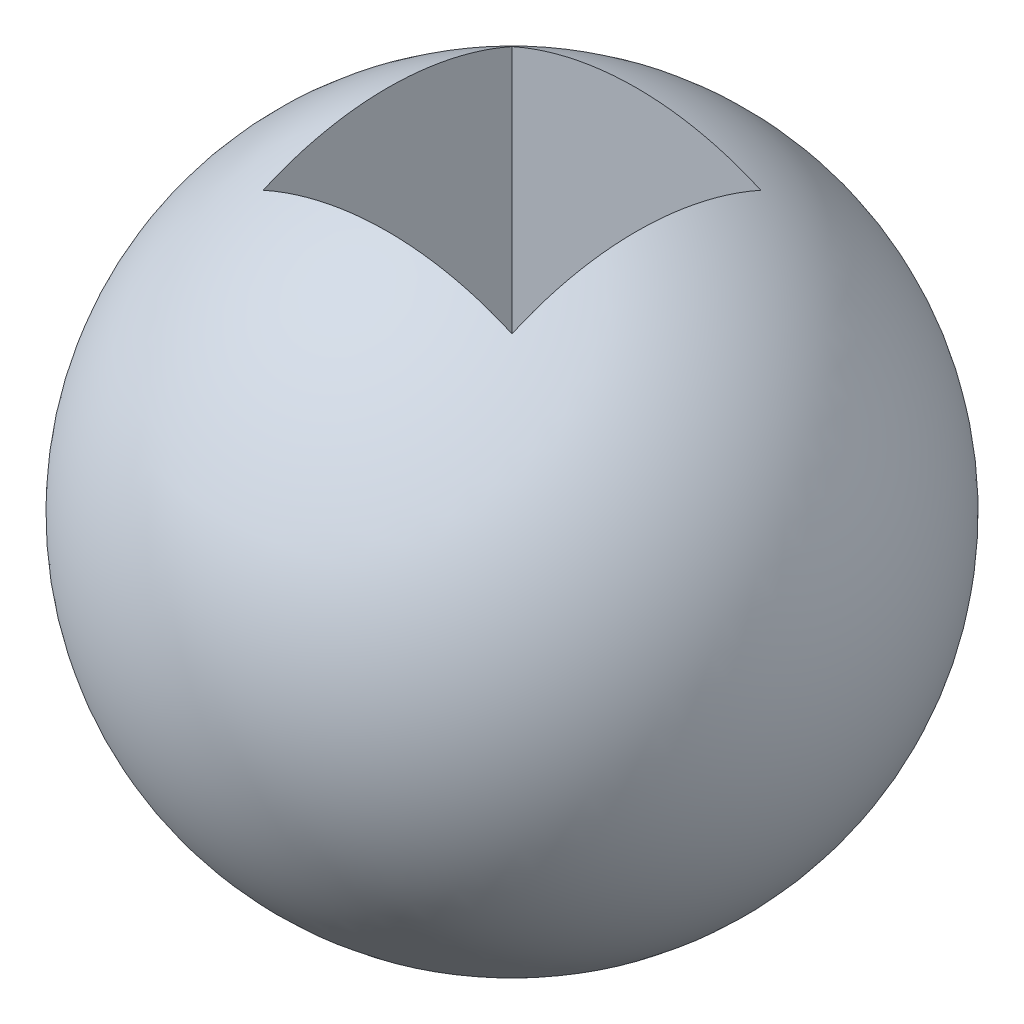
ISO-10303-21;
HEADER;
FILE_DESCRIPTION(('STEP AP214'),'2;1');
FILE_NAME('part.step','',(''),(''),'','','');
FILE_SCHEMA(('AUTOMOTIVE_DESIGN { 1 0 10303 214 1 1 1 1 }'));
ENDSEC;
DATA;
#1=APPLICATION_CONTEXT('core data for automotive mechanical design processes');
#2=APPLICATION_PROTOCOL_DEFINITION('international standard','automotive_design',2000,#1);
#3=PRODUCT_CONTEXT('',#1,'mechanical');
#4=PRODUCT('Part','Part','',(#3));
#5=PRODUCT_RELATED_PRODUCT_CATEGORY('part','',(#4));
#6=PRODUCT_DEFINITION_FORMATION('','',#4);
#7=PRODUCT_DEFINITION_CONTEXT('part definition',#1,'design');
#8=PRODUCT_DEFINITION('design','',#6,#7);
#9=PRODUCT_DEFINITION_SHAPE('','',#8);
#10=(LENGTH_UNIT() NAMED_UNIT(*) SI_UNIT(.MILLI.,.METRE.));
#11=(NAMED_UNIT(*) PLANE_ANGLE_UNIT() SI_UNIT($,.RADIAN.));
#12=(NAMED_UNIT(*) SI_UNIT($,.STERADIAN.) SOLID_ANGLE_UNIT());
#13=UNCERTAINTY_MEASURE_WITH_UNIT(LENGTH_MEASURE(1.E-05),#10,'distance_accuracy_value','');
#14=(GEOMETRIC_REPRESENTATION_CONTEXT(3) GLOBAL_UNCERTAINTY_ASSIGNED_CONTEXT((#13)) GLOBAL_UNIT_ASSIGNED_CONTEXT((#10,
#11,#12)) REPRESENTATION_CONTEXT('',''));
#15=CARTESIAN_POINT('',(0.,0.,0.));
#16=DIRECTION('',(0.,0.,1.));
#17=DIRECTION('',(1.,0.,0.));
#18=AXIS2_PLACEMENT_3D('',#15,#16,#17);
#19=CARTESIAN_POINT('',(0.,0.,0.));
#20=DIRECTION('',(0.,-1.,0.));
#21=DIRECTION('',(-1.,0.,0.));
#22=AXIS2_PLACEMENT_3D('',#19,#20,#21);
#23=SPHERICAL_SURFACE('',#22,33.655);
#24=CARTESIAN_POINT('',(-12.7,0.,0.));
#25=DIRECTION('',(-1.,0.,0.));
#26=DIRECTION('',(0.,0.,1.));
#27=AXIS2_PLACEMENT_3D('',#24,#25,#26);
#28=CIRCLE('',#27,31.1667936271924);
#29=CARTESIAN_POINT('',(-12.7,28.461887235389,-12.7));
#30=VERTEX_POINT('',#29);
#31=CARTESIAN_POINT('',(-12.7,28.461887235389,12.7));
#32=VERTEX_POINT('',#31);
#33=EDGE_CURVE('E11',#30,#32,#28,.F.);
#34=ORIENTED_EDGE('',*,*,#33,.F.);
#35=CARTESIAN_POINT('',(0.,0.,-12.7));
#36=DIRECTION('',(0.,0.,-1.));
#37=DIRECTION('',(-1.,0.,0.));
#38=AXIS2_PLACEMENT_3D('',#35,#36,#37);
#39=CIRCLE('',#38,31.1667936271924);
#40=CARTESIAN_POINT('',(12.7,28.461887235389,-12.7));
#41=VERTEX_POINT('',#40);
#42=EDGE_CURVE('E49',#41,#30,#39,.F.);
#43=ORIENTED_EDGE('',*,*,#42,.F.);
#44=CARTESIAN_POINT('',(12.7,0.,0.));
#45=DIRECTION('',(1.,0.,0.));
#46=DIRECTION('',(0.,0.,-1.));
#47=AXIS2_PLACEMENT_3D('',#44,#45,#46);
#48=CIRCLE('',#47,31.1667936271924);
#49=CARTESIAN_POINT('',(12.7,28.461887235389,12.7));
#50=VERTEX_POINT('',#49);
#51=EDGE_CURVE('E120',#50,#41,#48,.F.);
#52=ORIENTED_EDGE('',*,*,#51,.F.);
#53=CARTESIAN_POINT('',(0.,0.,12.7));
#54=DIRECTION('',(0.,0.,1.));
#55=DIRECTION('',(1.,0.,0.));
#56=AXIS2_PLACEMENT_3D('',#53,#54,#55);
#57=CIRCLE('',#56,31.1667936271924);
#58=EDGE_CURVE('E112',#32,#50,#57,.F.);
#59=ORIENTED_EDGE('',*,*,#58,.F.);
#60=EDGE_LOOP('',(#34,#43,#52,#59));
#61=FACE_BOUND('',#60,.T.);
#62=ADVANCED_FACE('F41',(#61),#23,.T.);
#63=CARTESIAN_POINT('',(-12.7,-25.4,12.7));
#64=DIRECTION('',(-1.,0.,0.));
#65=DIRECTION('',(0.,0.,1.));
#66=AXIS2_PLACEMENT_3D('',#63,#64,#65);
#67=PLANE('',#66);
#68=ORIENTED_EDGE('',*,*,#33,.T.);
#69=DIRECTION('',(0.,1.,0.));
#70=VECTOR('',#69,1.);
#71=CARTESIAN_POINT('',(-12.7,-25.4,12.7));
#72=LINE('',#71,#70);
#73=CARTESIAN_POINT('',(-12.7,-25.4,12.7));
#74=VERTEX_POINT('',#73);
#75=EDGE_CURVE('E56',#74,#32,#72,.T.);
#76=ORIENTED_EDGE('',*,*,#75,.F.);
#77=DIRECTION('',(0.,0.,1.));
#78=VECTOR('',#77,1.);
#79=CARTESIAN_POINT('',(-12.7,-25.4,12.7));
#80=LINE('',#79,#78);
#81=CARTESIAN_POINT('',(-12.7,-25.4,-12.7));
#82=VERTEX_POINT('',#81);
#83=EDGE_CURVE('E82',#82,#74,#80,.T.);
#84=ORIENTED_EDGE('',*,*,#83,.F.);
#85=DIRECTION('',(0.,1.,0.));
#86=VECTOR('',#85,1.);
#87=CARTESIAN_POINT('',(-12.7,-25.4,-12.7));
#88=LINE('',#87,#86);
#89=EDGE_CURVE('E109',#82,#30,#88,.T.);
#90=ORIENTED_EDGE('',*,*,#89,.T.);
#91=EDGE_LOOP('',(#68,#76,#84,#90));
#92=FACE_BOUND('',#91,.T.);
#93=ADVANCED_FACE('F80',(#92),#67,.F.);
#94=CARTESIAN_POINT('',(-12.7,-25.4,-12.7));
#95=DIRECTION('',(0.,0.,-1.));
#96=DIRECTION('',(-1.,0.,0.));
#97=AXIS2_PLACEMENT_3D('',#94,#95,#96);
#98=PLANE('',#97);
#99=ORIENTED_EDGE('',*,*,#42,.T.);
#100=ORIENTED_EDGE('',*,*,#89,.F.);
#101=DIRECTION('',(-1.,0.,0.));
#102=VECTOR('',#101,1.);
#103=CARTESIAN_POINT('',(-12.7,-25.4,-12.7));
#104=LINE('',#103,#102);
#105=CARTESIAN_POINT('',(12.7,-25.4,-12.7));
#106=VERTEX_POINT('',#105);
#107=EDGE_CURVE('E88',#106,#82,#104,.T.);
#108=ORIENTED_EDGE('',*,*,#107,.F.);
#109=DIRECTION('',(0.,1.,0.));
#110=VECTOR('',#109,1.);
#111=CARTESIAN_POINT('',(12.7,-25.4,-12.7));
#112=LINE('',#111,#110);
#113=EDGE_CURVE('E113',#106,#41,#112,.T.);
#114=ORIENTED_EDGE('',*,*,#113,.T.);
#115=EDGE_LOOP('',(#99,#100,#108,#114));
#116=FACE_BOUND('',#115,.T.);
#117=ADVANCED_FACE('F127',(#116),#98,.F.);
#118=CARTESIAN_POINT('',(12.7,-25.4,12.7));
#119=DIRECTION('',(1.,0.,0.));
#120=DIRECTION('',(0.,0.,-1.));
#121=AXIS2_PLACEMENT_3D('',#118,#119,#120);
#122=PLANE('',#121);
#123=ORIENTED_EDGE('',*,*,#51,.T.);
#124=ORIENTED_EDGE('',*,*,#113,.F.);
#125=DIRECTION('',(0.,0.,-1.));
#126=VECTOR('',#125,1.);
#127=CARTESIAN_POINT('',(12.7,-25.4,12.7));
#128=LINE('',#127,#126);
#129=CARTESIAN_POINT('',(12.7,-25.4,12.7));
#130=VERTEX_POINT('',#129);
#131=EDGE_CURVE('E98',#130,#106,#128,.T.);
#132=ORIENTED_EDGE('',*,*,#131,.F.);
#133=DIRECTION('',(0.,1.,0.));
#134=VECTOR('',#133,1.);
#135=CARTESIAN_POINT('',(12.7,-25.4,12.7));
#136=LINE('',#135,#134);
#137=EDGE_CURVE('E87',#130,#50,#136,.T.);
#138=ORIENTED_EDGE('',*,*,#137,.T.);
#139=EDGE_LOOP('',(#123,#124,#132,#138));
#140=FACE_BOUND('',#139,.T.);
#141=ADVANCED_FACE('F125',(#140),#122,.F.);
#142=CARTESIAN_POINT('',(-12.7,-25.4,12.7));
#143=DIRECTION('',(0.,0.,1.));
#144=DIRECTION('',(1.,0.,0.));
#145=AXIS2_PLACEMENT_3D('',#142,#143,#144);
#146=PLANE('',#145);
#147=ORIENTED_EDGE('',*,*,#58,.T.);
#148=ORIENTED_EDGE('',*,*,#137,.F.);
#149=DIRECTION('',(1.,0.,0.));
#150=VECTOR('',#149,1.);
#151=CARTESIAN_POINT('',(-12.7,-25.4,12.7));
#152=LINE('',#151,#150);
#153=EDGE_CURVE('E91',#74,#130,#152,.T.);
#154=ORIENTED_EDGE('',*,*,#153,.F.);
#155=ORIENTED_EDGE('',*,*,#75,.T.);
#156=EDGE_LOOP('',(#147,#148,#154,#155));
#157=FACE_BOUND('',#156,.T.);
#158=ADVANCED_FACE('F92',(#157),#146,.F.);
#159=CARTESIAN_POINT('',(0.,-25.4,0.));
#160=DIRECTION('',(0.,-1.,0.));
#161=DIRECTION('',(0.,0.,-1.));
#162=AXIS2_PLACEMENT_3D('',#159,#160,#161);
#163=PLANE('',#162);
#164=ORIENTED_EDGE('',*,*,#83,.T.);
#165=ORIENTED_EDGE('',*,*,#153,.T.);
#166=ORIENTED_EDGE('',*,*,#131,.T.);
#167=ORIENTED_EDGE('',*,*,#107,.T.);
#168=EDGE_LOOP('',(#164,#165,#166,#167));
#169=FACE_BOUND('',#168,.T.);
#170=ADVANCED_FACE('F100',(#169),#163,.F.);
#171=CLOSED_SHELL('',(#62,#93,#117,#141,#158,#170));
#172=MANIFOLD_SOLID_BREP('B2',#171);
#173=ADVANCED_BREP_SHAPE_REPRESENTATION('',(#18,#172),#14);
#174=SHAPE_DEFINITION_REPRESENTATION(#9,#173);
ENDSEC;
END-ISO-10303-21;
